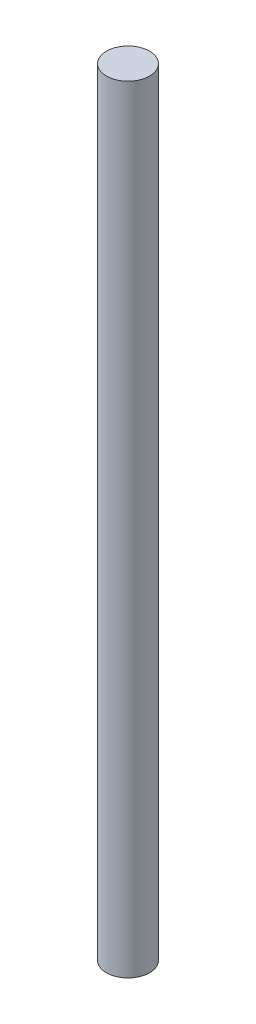
ISO-10303-21;
HEADER;
FILE_DESCRIPTION(('STEP AP214'),'2;1');
FILE_NAME('part.step','',(''),(''),'','','');
FILE_SCHEMA(('AUTOMOTIVE_DESIGN { 1 0 10303 214 1 1 1 1 }'));
ENDSEC;
DATA;
#1=APPLICATION_CONTEXT('core data for automotive mechanical design processes');
#2=APPLICATION_PROTOCOL_DEFINITION('international standard','automotive_design',2000,#1);
#3=PRODUCT_CONTEXT('',#1,'mechanical');
#4=PRODUCT('Part','Part','',(#3));
#5=PRODUCT_RELATED_PRODUCT_CATEGORY('part','',(#4));
#6=PRODUCT_DEFINITION_FORMATION('','',#4);
#7=PRODUCT_DEFINITION_CONTEXT('part definition',#1,'design');
#8=PRODUCT_DEFINITION('design','',#6,#7);
#9=PRODUCT_DEFINITION_SHAPE('','',#8);
#10=(LENGTH_UNIT() NAMED_UNIT(*) SI_UNIT(.MILLI.,.METRE.));
#11=(NAMED_UNIT(*) PLANE_ANGLE_UNIT() SI_UNIT($,.RADIAN.));
#12=(NAMED_UNIT(*) SI_UNIT($,.STERADIAN.) SOLID_ANGLE_UNIT());
#13=UNCERTAINTY_MEASURE_WITH_UNIT(LENGTH_MEASURE(1.E-05),#10,'distance_accuracy_value','');
#14=(GEOMETRIC_REPRESENTATION_CONTEXT(3) GLOBAL_UNCERTAINTY_ASSIGNED_CONTEXT((#13)) GLOBAL_UNIT_ASSIGNED_CONTEXT((#10,
#11,#12)) REPRESENTATION_CONTEXT('',''));
#15=CARTESIAN_POINT('',(0.,0.,0.));
#16=DIRECTION('',(0.,0.,1.));
#17=DIRECTION('',(1.,0.,0.));
#18=AXIS2_PLACEMENT_3D('',#15,#16,#17);
#19=CARTESIAN_POINT('',(0.,180.,0.));
#20=DIRECTION('',(0.,-1.,0.));
#21=DIRECTION('',(0.,0.,-1.));
#22=AXIS2_PLACEMENT_3D('',#19,#20,#21);
#23=CYLINDRICAL_SURFACE('',#22,5.);
#24=CARTESIAN_POINT('',(0.,180.,0.));
#25=DIRECTION('',(0.,1.,0.));
#26=DIRECTION('',(0.,0.,1.));
#27=AXIS2_PLACEMENT_3D('',#24,#25,#26);
#28=CIRCLE('',#27,5.);
#29=CARTESIAN_POINT('',(0.,180.,-5.));
#30=VERTEX_POINT('',#29);
#31=EDGE_CURVE('E10',#30,#30,#28,.T.);
#32=CARTESIAN_POINT('',(0.,0.,0.));
#33=DIRECTION('',(0.,1.,0.));
#34=DIRECTION('',(0.,0.,1.));
#35=AXIS2_PLACEMENT_3D('',#32,#33,#34);
#36=CIRCLE('',#35,5.);
#37=CARTESIAN_POINT('',(0.,0.,-5.));
#38=VERTEX_POINT('',#37);
#39=EDGE_CURVE('E44',#38,#38,#36,.T.);
#40=CARTESIAN_POINT('',(0.,180.,-5.));
#41=CARTESIAN_POINT('',(0.,178.125,-5.));
#42=CARTESIAN_POINT('',(0.,176.25,-5.));
#43=CARTESIAN_POINT('',(0.,172.5,-5.));
#44=CARTESIAN_POINT('',(0.,170.625,-5.));
#45=CARTESIAN_POINT('',(0.,166.875,-5.));
#46=CARTESIAN_POINT('',(0.,165.,-5.));
#47=CARTESIAN_POINT('',(0.,161.25,-5.));
#48=CARTESIAN_POINT('',(0.,159.375,-5.));
#49=CARTESIAN_POINT('',(0.,155.625,-5.));
#50=CARTESIAN_POINT('',(0.,153.75,-5.));
#51=CARTESIAN_POINT('',(0.,150.,-5.));
#52=CARTESIAN_POINT('',(0.,148.125,-5.));
#53=CARTESIAN_POINT('',(0.,144.375,-5.));
#54=CARTESIAN_POINT('',(0.,142.5,-5.));
#55=CARTESIAN_POINT('',(0.,138.75,-5.));
#56=CARTESIAN_POINT('',(0.,136.875,-5.));
#57=CARTESIAN_POINT('',(0.,133.125,-5.));
#58=CARTESIAN_POINT('',(0.,131.25,-5.));
#59=CARTESIAN_POINT('',(0.,127.5,-5.));
#60=CARTESIAN_POINT('',(0.,125.625,-5.));
#61=CARTESIAN_POINT('',(0.,121.875,-5.));
#62=CARTESIAN_POINT('',(0.,120.,-5.));
#63=CARTESIAN_POINT('',(0.,116.25,-5.));
#64=CARTESIAN_POINT('',(0.,114.375,-5.));
#65=CARTESIAN_POINT('',(0.,110.625,-5.));
#66=CARTESIAN_POINT('',(0.,108.75,-5.));
#67=CARTESIAN_POINT('',(0.,105.,-5.));
#68=CARTESIAN_POINT('',(0.,103.125,-5.));
#69=CARTESIAN_POINT('',(0.,99.375,-5.));
#70=CARTESIAN_POINT('',(0.,97.5,-5.));
#71=CARTESIAN_POINT('',(0.,93.75,-5.));
#72=CARTESIAN_POINT('',(0.,91.875,-5.));
#73=CARTESIAN_POINT('',(0.,88.125,-5.));
#74=CARTESIAN_POINT('',(0.,86.25,-5.));
#75=CARTESIAN_POINT('',(0.,82.5,-5.));
#76=CARTESIAN_POINT('',(0.,80.625,-5.));
#77=CARTESIAN_POINT('',(0.,76.875,-5.));
#78=CARTESIAN_POINT('',(0.,75.,-5.));
#79=CARTESIAN_POINT('',(0.,71.25,-5.));
#80=CARTESIAN_POINT('',(0.,69.375,-5.));
#81=CARTESIAN_POINT('',(0.,65.625,-5.));
#82=CARTESIAN_POINT('',(0.,63.75,-5.));
#83=CARTESIAN_POINT('',(0.,60.,-5.));
#84=CARTESIAN_POINT('',(0.,58.125,-5.));
#85=CARTESIAN_POINT('',(0.,54.375,-5.));
#86=CARTESIAN_POINT('',(0.,52.5,-5.));
#87=CARTESIAN_POINT('',(0.,48.75,-5.));
#88=CARTESIAN_POINT('',(0.,46.875,-5.));
#89=CARTESIAN_POINT('',(0.,43.125,-5.));
#90=CARTESIAN_POINT('',(0.,41.25,-5.));
#91=CARTESIAN_POINT('',(0.,37.5,-5.));
#92=CARTESIAN_POINT('',(0.,35.625,-5.));
#93=CARTESIAN_POINT('',(0.,31.875,-5.));
#94=CARTESIAN_POINT('',(0.,30.,-5.));
#95=CARTESIAN_POINT('',(0.,26.25,-5.));
#96=CARTESIAN_POINT('',(0.,24.375,-5.));
#97=CARTESIAN_POINT('',(0.,20.625,-5.));
#98=CARTESIAN_POINT('',(0.,18.75,-5.));
#99=CARTESIAN_POINT('',(0.,15.,-5.));
#100=CARTESIAN_POINT('',(0.,13.125,-5.));
#101=CARTESIAN_POINT('',(0.,9.37499999999998,-5.));
#102=CARTESIAN_POINT('',(0.,7.49999999999997,-5.));
#103=CARTESIAN_POINT('',(0.,3.74999999999997,-5.));
#104=CARTESIAN_POINT('',(0.,1.87499999999997,-5.));
#105=CARTESIAN_POINT('',(0.,0.,-5.));
#106=B_SPLINE_CURVE_WITH_KNOTS('',3,(#40,#41,#42,#43,#44,#45,#46,#47,#48,#49,#50,#51,#52,#53,
#54,#55,#56,#57,#58,#59,#60,#61,#62,#63,#64,#65,#66,#67,#68,#69,#70,#71,#72,#73,#74,#75,#76,#77,
#78,#79,#80,#81,#82,#83,#84,#85,#86,#87,#88,#89,#90,#91,#92,#93,#94,#95,#96,#97,#98,#99,#100,
#101,#102,#103,#104,#105),.UNSPECIFIED.,.F.,.F.,(4,2,2,2,2,2,2,2,2,2,2,2,2,2,2,2,2,2,2,2,2,2,2,
2,2,2,2,2,2,2,2,2,4),(0.,5.62500000000002,11.25,16.875,22.5,28.125,33.75,39.375,45.,50.625,
56.25,61.875,67.5,73.125,78.75,84.375,90.,95.625,101.25,106.875,112.5,118.125,123.75,129.375,
135.,140.625,146.25,151.875,157.5,163.125,168.75,174.375,180.),.UNSPECIFIED.);
#107=EDGE_CURVE('BSEAM41',#30,#38,#106,.T.);
#108=ORIENTED_EDGE('',*,*,#31,.F.);
#109=ORIENTED_EDGE('',*,*,#39,.T.);
#110=ORIENTED_EDGE('',*,*,#107,.T.);
#111=ORIENTED_EDGE('',*,*,#107,.F.);
#112=EDGE_LOOP('',(#108,#110,#109,#111));
#113=FACE_BOUND('',#112,.T.);
#114=ADVANCED_FACE('F41',(#113),#23,.T.);
#115=CARTESIAN_POINT('',(0.,180.,0.));
#116=DIRECTION('',(0.,1.,0.));
#117=DIRECTION('',(0.,0.,1.));
#118=AXIS2_PLACEMENT_3D('',#115,#116,#117);
#119=PLANE('',#118);
#120=ORIENTED_EDGE('',*,*,#31,.T.);
#121=EDGE_LOOP('',(#120));
#122=FACE_BOUND('',#121,.T.);
#123=ADVANCED_FACE('F58',(#122),#119,.T.);
#124=CARTESIAN_POINT('',(0.,0.,0.));
#125=DIRECTION('',(0.,1.,0.));
#126=DIRECTION('',(0.,0.,1.));
#127=AXIS2_PLACEMENT_3D('',#124,#125,#126);
#128=PLANE('',#127);
#129=ORIENTED_EDGE('',*,*,#39,.F.);
#130=EDGE_LOOP('',(#129));
#131=FACE_BOUND('',#130,.T.);
#132=ADVANCED_FACE('F56',(#131),#128,.F.);
#133=CLOSED_SHELL('',(#114,#123,#132));
#134=MANIFOLD_SOLID_BREP('B2',#133);
#135=ADVANCED_BREP_SHAPE_REPRESENTATION('',(#18,#134),#14);
#136=SHAPE_DEFINITION_REPRESENTATION(#9,#135);
ENDSEC;
END-ISO-10303-21;
